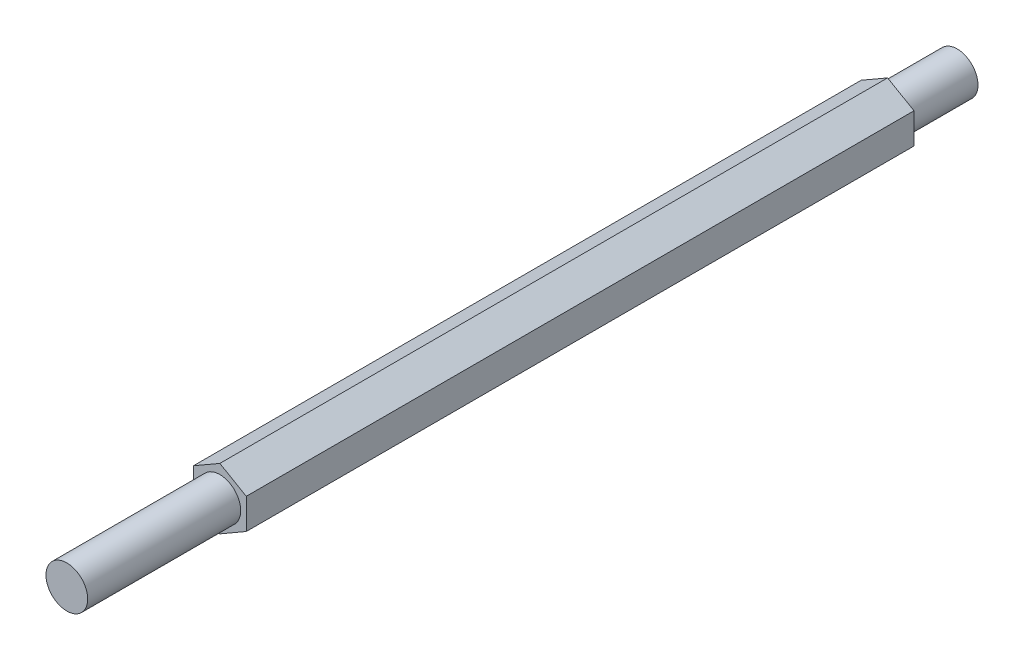
ISO-10303-21;
HEADER;
FILE_DESCRIPTION(('STEP AP214'),'2;1');
FILE_NAME('part.step','',(''),(''),'','','');
FILE_SCHEMA(('AUTOMOTIVE_DESIGN { 1 0 10303 214 1 1 1 1 }'));
ENDSEC;
DATA;
#1=APPLICATION_CONTEXT('core data for automotive mechanical design processes');
#2=APPLICATION_PROTOCOL_DEFINITION('international standard','automotive_design',2000,#1);
#3=PRODUCT_CONTEXT('',#1,'mechanical');
#4=PRODUCT('Part','Part','',(#3));
#5=PRODUCT_RELATED_PRODUCT_CATEGORY('part','',(#4));
#6=PRODUCT_DEFINITION_FORMATION('','',#4);
#7=PRODUCT_DEFINITION_CONTEXT('part definition',#1,'design');
#8=PRODUCT_DEFINITION('design','',#6,#7);
#9=PRODUCT_DEFINITION_SHAPE('','',#8);
#10=(LENGTH_UNIT() NAMED_UNIT(*) SI_UNIT(.MILLI.,.METRE.));
#11=(NAMED_UNIT(*) PLANE_ANGLE_UNIT() SI_UNIT($,.RADIAN.));
#12=(NAMED_UNIT(*) SI_UNIT($,.STERADIAN.) SOLID_ANGLE_UNIT());
#13=UNCERTAINTY_MEASURE_WITH_UNIT(LENGTH_MEASURE(1.E-05),#10,'distance_accuracy_value','');
#14=(GEOMETRIC_REPRESENTATION_CONTEXT(3) GLOBAL_UNCERTAINTY_ASSIGNED_CONTEXT((#13)) GLOBAL_UNIT_ASSIGNED_CONTEXT((#10,
#11,#12)) REPRESENTATION_CONTEXT('',''));
#15=CARTESIAN_POINT('',(0.,0.,0.));
#16=DIRECTION('',(0.,0.,1.));
#17=DIRECTION('',(1.,0.,0.));
#18=AXIS2_PLACEMENT_3D('',#15,#16,#17);
#19=CARTESIAN_POINT('',(0.,-10.9696551146029,320.));
#20=DIRECTION('',(-0.5,0.866025403784439,0.));
#21=DIRECTION('',(-0.866025403784439,-0.5,0.));
#22=AXIS2_PLACEMENT_3D('',#19,#20,#21);
#23=PLANE('',#22);
#24=DIRECTION('',(0.,0.,-1.));
#25=VECTOR('',#24,1.);
#26=CARTESIAN_POINT('',(0.,-10.9696551146029,320.));
#27=LINE('',#26,#25);
#28=CARTESIAN_POINT('',(0.,-10.9696551146029,265.));
#29=VERTEX_POINT('',#28);
#30=CARTESIAN_POINT('',(0.,-10.9696551146029,25.));
#31=VERTEX_POINT('',#30);
#32=EDGE_CURVE('E120',#29,#31,#27,.T.);
#33=ORIENTED_EDGE('',*,*,#32,.T.);
#34=DIRECTION('',(0.866025403784439,0.5,0.));
#35=VECTOR('',#34,1.);
#36=CARTESIAN_POINT('',(0.,-10.9696551146029,25.));
#37=LINE('',#36,#35);
#38=CARTESIAN_POINT('',(9.5,-5.48482755730145,25.));
#39=VERTEX_POINT('',#38);
#40=EDGE_CURVE('E47',#31,#39,#37,.T.);
#41=ORIENTED_EDGE('',*,*,#40,.T.);
#42=DIRECTION('',(0.,0.,-1.));
#43=VECTOR('',#42,1.);
#44=CARTESIAN_POINT('',(9.5,-5.48482755730145,320.));
#45=LINE('',#44,#43);
#46=CARTESIAN_POINT('',(9.5,-5.48482755730145,265.));
#47=VERTEX_POINT('',#46);
#48=EDGE_CURVE('E100',#47,#39,#45,.T.);
#49=ORIENTED_EDGE('',*,*,#48,.F.);
#50=DIRECTION('',(0.866025403784439,0.5,0.));
#51=VECTOR('',#50,1.);
#52=CARTESIAN_POINT('',(0.,-10.9696551146029,265.));
#53=LINE('',#52,#51);
#54=EDGE_CURVE('E113',#29,#47,#53,.T.);
#55=ORIENTED_EDGE('',*,*,#54,.F.);
#56=EDGE_LOOP('',(#33,#41,#49,#55));
#57=FACE_BOUND('',#56,.T.);
#58=ADVANCED_FACE('F33',(#57),#23,.F.);
#59=CARTESIAN_POINT('',(9.5,-5.48482755730145,320.));
#60=DIRECTION('',(-1.,0.,0.));
#61=DIRECTION('',(0.,-1.,0.));
#62=AXIS2_PLACEMENT_3D('',#59,#60,#61);
#63=PLANE('',#62);
#64=ORIENTED_EDGE('',*,*,#48,.T.);
#65=DIRECTION('',(0.,1.,0.));
#66=VECTOR('',#65,1.);
#67=CARTESIAN_POINT('',(9.5,-5.48482755730145,25.));
#68=LINE('',#67,#66);
#69=CARTESIAN_POINT('',(9.50000000000001,5.48482755730144,25.));
#70=VERTEX_POINT('',#69);
#71=EDGE_CURVE('E85',#39,#70,#68,.T.);
#72=ORIENTED_EDGE('',*,*,#71,.T.);
#73=DIRECTION('',(0.,0.,-1.));
#74=VECTOR('',#73,1.);
#75=CARTESIAN_POINT('',(9.5,5.48482755730145,320.));
#76=LINE('',#75,#74);
#77=CARTESIAN_POINT('',(9.5,5.48482755730145,265.));
#78=VERTEX_POINT('',#77);
#79=EDGE_CURVE('E98',#78,#70,#76,.T.);
#80=ORIENTED_EDGE('',*,*,#79,.F.);
#81=DIRECTION('',(0.,1.,0.));
#82=VECTOR('',#81,1.);
#83=CARTESIAN_POINT('',(9.5,-5.48482755730145,265.));
#84=LINE('',#83,#82);
#85=EDGE_CURVE('E121',#47,#78,#84,.T.);
#86=ORIENTED_EDGE('',*,*,#85,.F.);
#87=EDGE_LOOP('',(#64,#72,#80,#86));
#88=FACE_BOUND('',#87,.T.);
#89=ADVANCED_FACE('F96',(#88),#63,.F.);
#90=CARTESIAN_POINT('',(9.5,5.48482755730145,320.));
#91=DIRECTION('',(-0.5,-0.866025403784439,0.));
#92=DIRECTION('',(0.866025403784439,-0.5,0.));
#93=AXIS2_PLACEMENT_3D('',#90,#91,#92);
#94=PLANE('',#93);
#95=ORIENTED_EDGE('',*,*,#79,.T.);
#96=DIRECTION('',(-0.866025403784439,0.5,0.));
#97=VECTOR('',#96,1.);
#98=CARTESIAN_POINT('',(9.5,5.48482755730145,25.));
#99=LINE('',#98,#97);
#100=CARTESIAN_POINT('',(0.,10.9696551146029,25.));
#101=VERTEX_POINT('',#100);
#102=EDGE_CURVE('E82',#70,#101,#99,.T.);
#103=ORIENTED_EDGE('',*,*,#102,.T.);
#104=DIRECTION('',(0.,0.,-1.));
#105=VECTOR('',#104,1.);
#106=CARTESIAN_POINT('',(0.,10.9696551146029,320.));
#107=LINE('',#106,#105);
#108=CARTESIAN_POINT('',(0.,10.9696551146029,265.));
#109=VERTEX_POINT('',#108);
#110=EDGE_CURVE('E105',#109,#101,#107,.T.);
#111=ORIENTED_EDGE('',*,*,#110,.F.);
#112=DIRECTION('',(-0.866025403784439,0.5,0.));
#113=VECTOR('',#112,1.);
#114=CARTESIAN_POINT('',(9.5,5.48482755730145,265.));
#115=LINE('',#114,#113);
#116=EDGE_CURVE('E104',#78,#109,#115,.T.);
#117=ORIENTED_EDGE('',*,*,#116,.F.);
#118=EDGE_LOOP('',(#95,#103,#111,#117));
#119=FACE_BOUND('',#118,.T.);
#120=ADVANCED_FACE('F103',(#119),#94,.F.);
#121=CARTESIAN_POINT('',(0.,10.9696551146029,320.));
#122=DIRECTION('',(0.5,-0.866025403784439,0.));
#123=DIRECTION('',(0.866025403784439,0.5,0.));
#124=AXIS2_PLACEMENT_3D('',#121,#122,#123);
#125=PLANE('',#124);
#126=ORIENTED_EDGE('',*,*,#110,.T.);
#127=DIRECTION('',(-0.866025403784439,-0.5,0.));
#128=VECTOR('',#127,1.);
#129=CARTESIAN_POINT('',(0.,10.9696551146029,25.));
#130=LINE('',#129,#128);
#131=CARTESIAN_POINT('',(-9.5,5.48482755730145,25.));
#132=VERTEX_POINT('',#131);
#133=EDGE_CURVE('E87',#101,#132,#130,.T.);
#134=ORIENTED_EDGE('',*,*,#133,.T.);
#135=DIRECTION('',(0.,0.,-1.));
#136=VECTOR('',#135,1.);
#137=CARTESIAN_POINT('',(-9.5,5.48482755730144,320.));
#138=LINE('',#137,#136);
#139=CARTESIAN_POINT('',(-9.5,5.48482755730145,265.));
#140=VERTEX_POINT('',#139);
#141=EDGE_CURVE('E108',#140,#132,#138,.T.);
#142=ORIENTED_EDGE('',*,*,#141,.F.);
#143=DIRECTION('',(-0.866025403784439,-0.5,0.));
#144=VECTOR('',#143,1.);
#145=CARTESIAN_POINT('',(0.,10.9696551146029,265.));
#146=LINE('',#145,#144);
#147=EDGE_CURVE('E137',#109,#140,#146,.T.);
#148=ORIENTED_EDGE('',*,*,#147,.F.);
#149=EDGE_LOOP('',(#126,#134,#142,#148));
#150=FACE_BOUND('',#149,.T.);
#151=ADVANCED_FACE('F136',(#150),#125,.F.);
#152=CARTESIAN_POINT('',(-9.5,5.48482755730144,320.));
#153=DIRECTION('',(1.,0.,0.));
#154=DIRECTION('',(0.,0.,-1.));
#155=AXIS2_PLACEMENT_3D('',#152,#153,#154);
#156=PLANE('',#155);
#157=ORIENTED_EDGE('',*,*,#141,.T.);
#158=DIRECTION('',(0.,-1.,0.));
#159=VECTOR('',#158,1.);
#160=CARTESIAN_POINT('',(-9.5,5.48482755730144,25.));
#161=LINE('',#160,#159);
#162=CARTESIAN_POINT('',(-9.5,-5.48482755730144,25.));
#163=VERTEX_POINT('',#162);
#164=EDGE_CURVE('E133',#132,#163,#161,.T.);
#165=ORIENTED_EDGE('',*,*,#164,.T.);
#166=DIRECTION('',(0.,0.,-1.));
#167=VECTOR('',#166,1.);
#168=CARTESIAN_POINT('',(-9.5,-5.48482755730145,320.));
#169=LINE('',#168,#167);
#170=CARTESIAN_POINT('',(-9.5,-5.48482755730145,265.));
#171=VERTEX_POINT('',#170);
#172=EDGE_CURVE('E124',#171,#163,#169,.T.);
#173=ORIENTED_EDGE('',*,*,#172,.F.);
#174=DIRECTION('',(0.,-1.,0.));
#175=VECTOR('',#174,1.);
#176=CARTESIAN_POINT('',(-9.5,5.48482755730144,265.));
#177=LINE('',#176,#175);
#178=EDGE_CURVE('E54',#140,#171,#177,.T.);
#179=ORIENTED_EDGE('',*,*,#178,.F.);
#180=EDGE_LOOP('',(#157,#165,#173,#179));
#181=FACE_BOUND('',#180,.T.);
#182=ADVANCED_FACE('F132',(#181),#156,.F.);
#183=CARTESIAN_POINT('',(-9.5,-5.48482755730145,320.));
#184=DIRECTION('',(0.5,0.866025403784439,0.));
#185=DIRECTION('',(-0.866025403784439,0.5,0.));
#186=AXIS2_PLACEMENT_3D('',#183,#184,#185);
#187=PLANE('',#186);
#188=ORIENTED_EDGE('',*,*,#172,.T.);
#189=DIRECTION('',(0.866025403784439,-0.5,0.));
#190=VECTOR('',#189,1.);
#191=CARTESIAN_POINT('',(-9.5,-5.48482755730145,25.));
#192=LINE('',#191,#190);
#193=EDGE_CURVE('E11',#163,#31,#192,.T.);
#194=ORIENTED_EDGE('',*,*,#193,.T.);
#195=ORIENTED_EDGE('',*,*,#32,.F.);
#196=DIRECTION('',(0.866025403784439,-0.5,0.));
#197=VECTOR('',#196,1.);
#198=CARTESIAN_POINT('',(-9.5,-5.48482755730145,265.));
#199=LINE('',#198,#197);
#200=EDGE_CURVE('E40',#171,#29,#199,.T.);
#201=ORIENTED_EDGE('',*,*,#200,.F.);
#202=EDGE_LOOP('',(#188,#194,#195,#201));
#203=FACE_BOUND('',#202,.T.);
#204=ADVANCED_FACE('F123',(#203),#187,.F.);
#205=CARTESIAN_POINT('',(0.,0.,265.));
#206=DIRECTION('',(0.,0.,1.));
#207=DIRECTION('',(1.,0.,0.));
#208=AXIS2_PLACEMENT_3D('',#205,#206,#207);
#209=PLANE('',#208);
#210=CARTESIAN_POINT('',(0.,0.,265.));
#211=DIRECTION('',(0.,0.,1.));
#212=DIRECTION('',(1.,0.,0.));
#213=AXIS2_PLACEMENT_3D('',#210,#211,#212);
#214=CIRCLE('',#213,7.5);
#215=CARTESIAN_POINT('',(7.5,0.,265.));
#216=VERTEX_POINT('',#215);
#217=EDGE_CURVE('E145',#216,#216,#214,.T.);
#218=ORIENTED_EDGE('',*,*,#217,.F.);
#219=EDGE_LOOP('',(#218));
#220=FACE_BOUND('',#219,.T.);
#221=ORIENTED_EDGE('',*,*,#54,.T.);
#222=ORIENTED_EDGE('',*,*,#85,.T.);
#223=ORIENTED_EDGE('',*,*,#116,.T.);
#224=ORIENTED_EDGE('',*,*,#147,.T.);
#225=ORIENTED_EDGE('',*,*,#178,.T.);
#226=ORIENTED_EDGE('',*,*,#200,.T.);
#227=EDGE_LOOP('',(#221,#222,#223,#224,#225,#226));
#228=FACE_BOUND('',#227,.T.);
#229=ADVANCED_FACE('F112',(#220,#228),#209,.T.);
#230=CARTESIAN_POINT('',(0.,0.,265.));
#231=DIRECTION('',(0.,0.,1.));
#232=DIRECTION('',(1.,0.,0.));
#233=AXIS2_PLACEMENT_3D('',#230,#231,#232);
#234=CYLINDRICAL_SURFACE('',#233,7.5);
#235=ORIENTED_EDGE('',*,*,#217,.T.);
#236=EDGE_LOOP('',(#235));
#237=FACE_BOUND('',#236,.T.);
#238=CARTESIAN_POINT('',(0.,0.,320.));
#239=DIRECTION('',(0.,0.,1.));
#240=DIRECTION('',(1.,0.,0.));
#241=AXIS2_PLACEMENT_3D('',#238,#239,#240);
#242=CIRCLE('',#241,7.5);
#243=CARTESIAN_POINT('',(7.5,0.,320.));
#244=VERTEX_POINT('',#243);
#245=EDGE_CURVE('E144',#244,#244,#242,.T.);
#246=ORIENTED_EDGE('',*,*,#245,.F.);
#247=EDGE_LOOP('',(#246));
#248=FACE_BOUND('',#247,.T.);
#249=ADVANCED_FACE('F156',(#237,#248),#234,.T.);
#250=CARTESIAN_POINT('',(0.,0.,320.));
#251=DIRECTION('',(0.,0.,1.));
#252=DIRECTION('',(1.,0.,0.));
#253=AXIS2_PLACEMENT_3D('',#250,#251,#252);
#254=PLANE('',#253);
#255=ORIENTED_EDGE('',*,*,#245,.T.);
#256=EDGE_LOOP('',(#255));
#257=FACE_BOUND('',#256,.T.);
#258=ADVANCED_FACE('F154',(#257),#254,.T.);
#259=CARTESIAN_POINT('',(0.,0.,25.));
#260=DIRECTION('',(0.,0.,1.));
#261=DIRECTION('',(1.,0.,0.));
#262=AXIS2_PLACEMENT_3D('',#259,#260,#261);
#263=PLANE('',#262);
#264=CARTESIAN_POINT('',(0.,0.,25.));
#265=DIRECTION('',(0.,0.,1.));
#266=DIRECTION('',(1.,0.,0.));
#267=AXIS2_PLACEMENT_3D('',#264,#265,#266);
#268=CIRCLE('',#267,7.5);
#269=CARTESIAN_POINT('',(7.5,0.,25.));
#270=VERTEX_POINT('',#269);
#271=EDGE_CURVE('E139',#270,#270,#268,.T.);
#272=ORIENTED_EDGE('',*,*,#271,.T.);
#273=EDGE_LOOP('',(#272));
#274=FACE_BOUND('',#273,.T.);
#275=ORIENTED_EDGE('',*,*,#193,.F.);
#276=ORIENTED_EDGE('',*,*,#164,.F.);
#277=ORIENTED_EDGE('',*,*,#133,.F.);
#278=ORIENTED_EDGE('',*,*,#102,.F.);
#279=ORIENTED_EDGE('',*,*,#71,.F.);
#280=ORIENTED_EDGE('',*,*,#40,.F.);
#281=EDGE_LOOP('',(#275,#276,#277,#278,#279,#280));
#282=FACE_BOUND('',#281,.T.);
#283=ADVANCED_FACE('F84',(#274,#282),#263,.F.);
#284=CARTESIAN_POINT('',(0.,0.,25.));
#285=DIRECTION('',(0.,0.,-1.));
#286=DIRECTION('',(-1.,0.,0.));
#287=AXIS2_PLACEMENT_3D('',#284,#285,#286);
#288=CYLINDRICAL_SURFACE('',#287,7.5);
#289=ORIENTED_EDGE('',*,*,#271,.F.);
#290=EDGE_LOOP('',(#289));
#291=FACE_BOUND('',#290,.T.);
#292=CARTESIAN_POINT('',(0.,0.,0.));
#293=DIRECTION('',(0.,0.,1.));
#294=DIRECTION('',(1.,0.,0.));
#295=AXIS2_PLACEMENT_3D('',#292,#293,#294);
#296=CIRCLE('',#295,7.5);
#297=CARTESIAN_POINT('',(7.5,0.,0.));
#298=VERTEX_POINT('',#297);
#299=EDGE_CURVE('E194',#298,#298,#296,.T.);
#300=ORIENTED_EDGE('',*,*,#299,.T.);
#301=EDGE_LOOP('',(#300));
#302=FACE_BOUND('',#301,.T.);
#303=ADVANCED_FACE('F185',(#291,#302),#288,.T.);
#304=CARTESIAN_POINT('',(0.,0.,0.));
#305=DIRECTION('',(0.,0.,1.));
#306=DIRECTION('',(1.,0.,0.));
#307=AXIS2_PLACEMENT_3D('',#304,#305,#306);
#308=PLANE('',#307);
#309=ORIENTED_EDGE('',*,*,#299,.F.);
#310=EDGE_LOOP('',(#309));
#311=FACE_BOUND('',#310,.T.);
#312=ADVANCED_FACE('F183',(#311),#308,.F.);
#313=CLOSED_SHELL('',(#58,#89,#120,#151,#182,#204,#229,#249,#258,#283,#303,#312));
#314=MANIFOLD_SOLID_BREP('B2',#313);
#315=ADVANCED_BREP_SHAPE_REPRESENTATION('',(#18,#314),#14);
#316=SHAPE_DEFINITION_REPRESENTATION(#9,#315);
ENDSEC;
END-ISO-10303-21;
